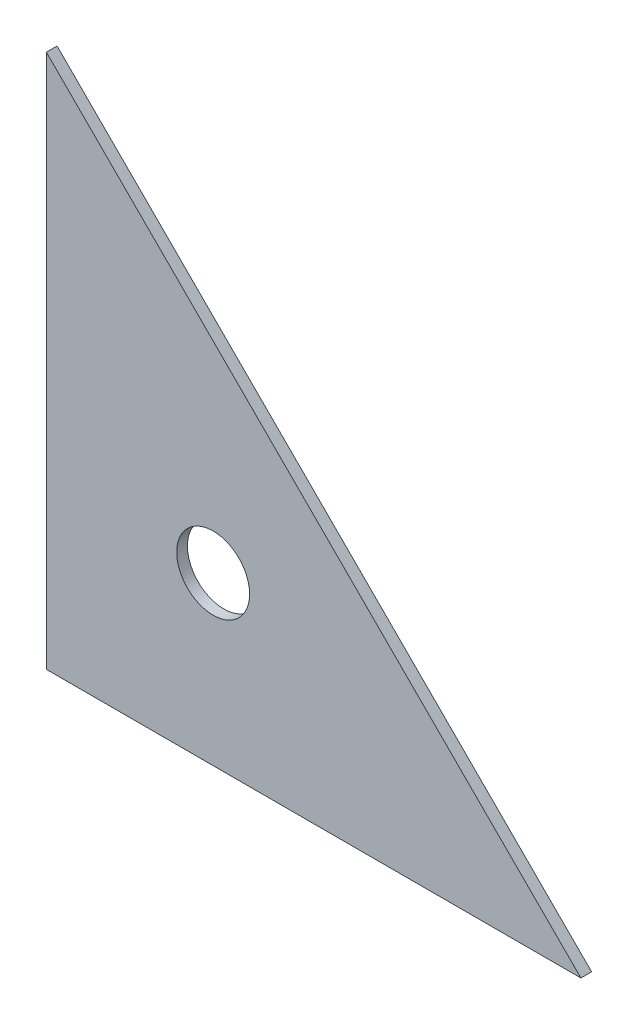
ISO-10303-21;
HEADER;
FILE_DESCRIPTION(('STEP AP214'),'2;1');
FILE_NAME('part.step','',(''),(''),'','','');
FILE_SCHEMA(('AUTOMOTIVE_DESIGN { 1 0 10303 214 1 1 1 1 }'));
ENDSEC;
DATA;
#1=APPLICATION_CONTEXT('core data for automotive mechanical design processes');
#2=APPLICATION_PROTOCOL_DEFINITION('international standard','automotive_design',2000,#1);
#3=PRODUCT_CONTEXT('',#1,'mechanical');
#4=PRODUCT('Part','Part','',(#3));
#5=PRODUCT_RELATED_PRODUCT_CATEGORY('part','',(#4));
#6=PRODUCT_DEFINITION_FORMATION('','',#4);
#7=PRODUCT_DEFINITION_CONTEXT('part definition',#1,'design');
#8=PRODUCT_DEFINITION('design','',#6,#7);
#9=PRODUCT_DEFINITION_SHAPE('','',#8);
#10=(LENGTH_UNIT() NAMED_UNIT(*) SI_UNIT(.MILLI.,.METRE.));
#11=(NAMED_UNIT(*) PLANE_ANGLE_UNIT() SI_UNIT($,.RADIAN.));
#12=(NAMED_UNIT(*) SI_UNIT($,.STERADIAN.) SOLID_ANGLE_UNIT());
#13=UNCERTAINTY_MEASURE_WITH_UNIT(LENGTH_MEASURE(1.E-05),#10,'distance_accuracy_value','');
#14=(GEOMETRIC_REPRESENTATION_CONTEXT(3) GLOBAL_UNCERTAINTY_ASSIGNED_CONTEXT((#13)) GLOBAL_UNIT_ASSIGNED_CONTEXT((#10,
#11,#12)) REPRESENTATION_CONTEXT('',''));
#15=CARTESIAN_POINT('',(0.,0.,0.));
#16=DIRECTION('',(0.,0.,1.));
#17=DIRECTION('',(1.,0.,0.));
#18=AXIS2_PLACEMENT_3D('',#15,#16,#17);
#19=CARTESIAN_POINT('',(0.,0.,0.5));
#20=DIRECTION('',(0.,0.,-1.));
#21=DIRECTION('',(-1.,0.,0.));
#22=AXIS2_PLACEMENT_3D('',#19,#20,#21);
#23=PLANE('',#22);
#24=DIRECTION('',(1.,0.,0.));
#25=VECTOR('',#24,1.);
#26=CARTESIAN_POINT('',(25.,0.,0.5));
#27=LINE('',#26,#25);
#28=CARTESIAN_POINT('',(0.,0.,0.5));
#29=VERTEX_POINT('',#28);
#30=CARTESIAN_POINT('',(25.,0.,0.5));
#31=VERTEX_POINT('',#30);
#32=EDGE_CURVE('E82',#29,#31,#27,.T.);
#33=ORIENTED_EDGE('',*,*,#32,.T.);
#34=DIRECTION('',(-0.707106781186547,0.707106781186547,0.));
#35=VECTOR('',#34,1.);
#36=CARTESIAN_POINT('',(0.,25.,0.5));
#37=LINE('',#36,#35);
#38=CARTESIAN_POINT('',(0.,25.,0.5));
#39=VERTEX_POINT('',#38);
#40=EDGE_CURVE('E77',#31,#39,#37,.T.);
#41=ORIENTED_EDGE('',*,*,#40,.T.);
#42=DIRECTION('',(0.,-1.,0.));
#43=VECTOR('',#42,1.);
#44=CARTESIAN_POINT('',(0.,0.,0.5));
#45=LINE('',#44,#43);
#46=EDGE_CURVE('E57',#39,#29,#45,.T.);
#47=ORIENTED_EDGE('',*,*,#46,.T.);
#48=EDGE_LOOP('',(#33,#41,#47));
#49=FACE_BOUND('',#48,.T.);
#50=CARTESIAN_POINT('',(7.8,7.8,0.5));
#51=DIRECTION('',(0.,0.,1.));
#52=DIRECTION('',(1.,0.,0.));
#53=AXIS2_PLACEMENT_3D('',#50,#51,#52);
#54=CIRCLE('',#53,1.705);
#55=CARTESIAN_POINT('',(9.505,7.8,0.5));
#56=VERTEX_POINT('',#55);
#57=EDGE_CURVE('E94',#56,#56,#54,.T.);
#58=ORIENTED_EDGE('',*,*,#57,.F.);
#59=EDGE_LOOP('',(#58));
#60=FACE_BOUND('',#59,.T.);
#61=ADVANCED_FACE('F39',(#49,#60),#23,.F.);
#62=CARTESIAN_POINT('',(0.,0.,0.));
#63=DIRECTION('',(0.,0.,-1.));
#64=DIRECTION('',(-1.,0.,0.));
#65=AXIS2_PLACEMENT_3D('',#62,#63,#64);
#66=PLANE('',#65);
#67=DIRECTION('',(1.,0.,0.));
#68=VECTOR('',#67,1.);
#69=CARTESIAN_POINT('',(25.,0.,0.));
#70=LINE('',#69,#68);
#71=CARTESIAN_POINT('',(0.,0.,0.));
#72=VERTEX_POINT('',#71);
#73=CARTESIAN_POINT('',(25.,0.,0.));
#74=VERTEX_POINT('',#73);
#75=EDGE_CURVE('E90',#72,#74,#70,.T.);
#76=ORIENTED_EDGE('',*,*,#75,.F.);
#77=DIRECTION('',(0.,-1.,0.));
#78=VECTOR('',#77,1.);
#79=CARTESIAN_POINT('',(0.,0.,0.));
#80=LINE('',#79,#78);
#81=CARTESIAN_POINT('',(0.,25.,0.));
#82=VERTEX_POINT('',#81);
#83=EDGE_CURVE('E74',#82,#72,#80,.T.);
#84=ORIENTED_EDGE('',*,*,#83,.F.);
#85=DIRECTION('',(-0.707106781186547,0.707106781186547,0.));
#86=VECTOR('',#85,1.);
#87=CARTESIAN_POINT('',(0.,25.,0.));
#88=LINE('',#87,#86);
#89=EDGE_CURVE('E69',#74,#82,#88,.T.);
#90=ORIENTED_EDGE('',*,*,#89,.F.);
#91=EDGE_LOOP('',(#76,#84,#90));
#92=FACE_BOUND('',#91,.T.);
#93=CARTESIAN_POINT('',(7.8,7.8,0.));
#94=DIRECTION('',(0.,0.,1.));
#95=DIRECTION('',(1.,0.,0.));
#96=AXIS2_PLACEMENT_3D('',#93,#94,#95);
#97=CIRCLE('',#96,1.705);
#98=CARTESIAN_POINT('',(9.505,7.8,0.));
#99=VERTEX_POINT('',#98);
#100=EDGE_CURVE('E100',#99,#99,#97,.T.);
#101=ORIENTED_EDGE('',*,*,#100,.T.);
#102=EDGE_LOOP('',(#101));
#103=FACE_BOUND('',#102,.T.);
#104=ADVANCED_FACE('F109',(#92,#103),#66,.T.);
#105=CARTESIAN_POINT('',(25.,0.,0.5));
#106=DIRECTION('',(0.,1.,0.));
#107=DIRECTION('',(-1.,0.,0.));
#108=AXIS2_PLACEMENT_3D('',#105,#106,#107);
#109=PLANE('',#108);
#110=ORIENTED_EDGE('',*,*,#75,.T.);
#111=DIRECTION('',(0.,0.,-1.));
#112=VECTOR('',#111,1.);
#113=CARTESIAN_POINT('',(25.,0.,0.5));
#114=LINE('',#113,#112);
#115=EDGE_CURVE('E11',#31,#74,#114,.T.);
#116=ORIENTED_EDGE('',*,*,#115,.F.);
#117=ORIENTED_EDGE('',*,*,#32,.F.);
#118=DIRECTION('',(0.,0.,-1.));
#119=VECTOR('',#118,1.);
#120=CARTESIAN_POINT('',(0.,0.,0.5));
#121=LINE('',#120,#119);
#122=EDGE_CURVE('E91',#29,#72,#121,.T.);
#123=ORIENTED_EDGE('',*,*,#122,.T.);
#124=EDGE_LOOP('',(#110,#116,#117,#123));
#125=FACE_BOUND('',#124,.T.);
#126=ADVANCED_FACE('F41',(#125),#109,.F.);
#127=CARTESIAN_POINT('',(0.,25.,0.5));
#128=DIRECTION('',(-0.707106781186547,-0.707106781186547,0.));
#129=DIRECTION('',(0.707106781186548,-0.707106781186548,0.));
#130=AXIS2_PLACEMENT_3D('',#127,#128,#129);
#131=PLANE('',#130);
#132=ORIENTED_EDGE('',*,*,#89,.T.);
#133=DIRECTION('',(0.,0.,-1.));
#134=VECTOR('',#133,1.);
#135=CARTESIAN_POINT('',(0.,25.,0.5));
#136=LINE('',#135,#134);
#137=EDGE_CURVE('E49',#39,#82,#136,.T.);
#138=ORIENTED_EDGE('',*,*,#137,.F.);
#139=ORIENTED_EDGE('',*,*,#40,.F.);
#140=ORIENTED_EDGE('',*,*,#115,.T.);
#141=EDGE_LOOP('',(#132,#138,#139,#140));
#142=FACE_BOUND('',#141,.T.);
#143=ADVANCED_FACE('F78',(#142),#131,.F.);
#144=CARTESIAN_POINT('',(0.,0.,0.5));
#145=DIRECTION('',(1.,0.,0.));
#146=DIRECTION('',(0.,0.,-1.));
#147=AXIS2_PLACEMENT_3D('',#144,#145,#146);
#148=PLANE('',#147);
#149=ORIENTED_EDGE('',*,*,#83,.T.);
#150=ORIENTED_EDGE('',*,*,#122,.F.);
#151=ORIENTED_EDGE('',*,*,#46,.F.);
#152=ORIENTED_EDGE('',*,*,#137,.T.);
#153=EDGE_LOOP('',(#149,#150,#151,#152));
#154=FACE_BOUND('',#153,.T.);
#155=ADVANCED_FACE('F108',(#154),#148,.F.);
#156=CARTESIAN_POINT('',(7.8,7.8,0.5));
#157=DIRECTION('',(0.,0.,-1.));
#158=DIRECTION('',(-1.,0.,0.));
#159=AXIS2_PLACEMENT_3D('',#156,#157,#158);
#160=CYLINDRICAL_SURFACE('',#159,1.705);
#161=ORIENTED_EDGE('',*,*,#57,.T.);
#162=EDGE_LOOP('',(#161));
#163=FACE_BOUND('',#162,.T.);
#164=ORIENTED_EDGE('',*,*,#100,.F.);
#165=EDGE_LOOP('',(#164));
#166=FACE_BOUND('',#165,.T.);
#167=ADVANCED_FACE('F118',(#163,#166),#160,.F.);
#168=CLOSED_SHELL('',(#61,#104,#126,#143,#155,#167));
#169=MANIFOLD_SOLID_BREP('B2',#168);
#170=ADVANCED_BREP_SHAPE_REPRESENTATION('',(#18,#169),#14);
#171=SHAPE_DEFINITION_REPRESENTATION(#9,#170);
ENDSEC;
END-ISO-10303-21;
